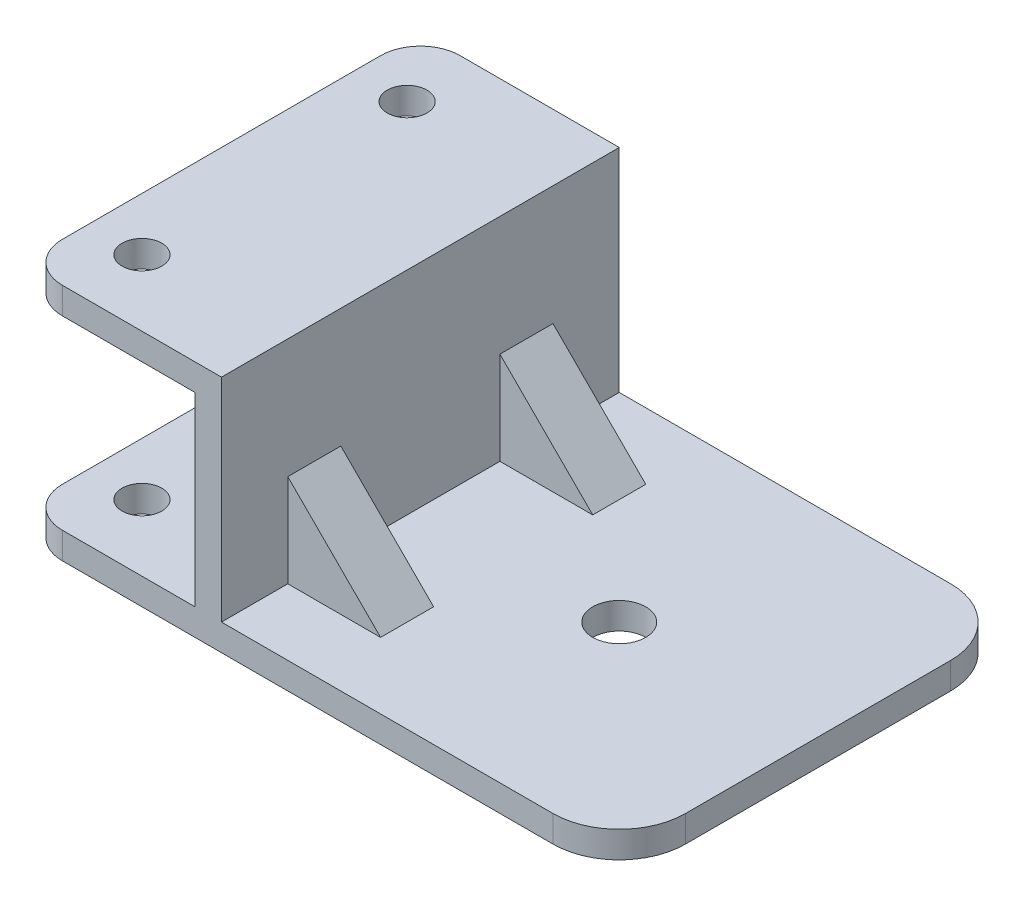
ISO-10303-21;
HEADER;
FILE_DESCRIPTION(('STEP AP214'),'2;1');
FILE_NAME('part.step','',(''),(''),'','','');
FILE_SCHEMA(('AUTOMOTIVE_DESIGN { 1 0 10303 214 1 1 1 1 }'));
ENDSEC;
DATA;
#1=APPLICATION_CONTEXT('core data for automotive mechanical design processes');
#2=APPLICATION_PROTOCOL_DEFINITION('international standard','automotive_design',2000,#1);
#3=PRODUCT_CONTEXT('',#1,'mechanical');
#4=PRODUCT('Part','Part','',(#3));
#5=PRODUCT_RELATED_PRODUCT_CATEGORY('part','',(#4));
#6=PRODUCT_DEFINITION_FORMATION('','',#4);
#7=PRODUCT_DEFINITION_CONTEXT('part definition',#1,'design');
#8=PRODUCT_DEFINITION('design','',#6,#7);
#9=PRODUCT_DEFINITION_SHAPE('','',#8);
#10=(LENGTH_UNIT() NAMED_UNIT(*) SI_UNIT(.MILLI.,.METRE.));
#11=(NAMED_UNIT(*) PLANE_ANGLE_UNIT() SI_UNIT($,.RADIAN.));
#12=(NAMED_UNIT(*) SI_UNIT($,.STERADIAN.) SOLID_ANGLE_UNIT());
#13=UNCERTAINTY_MEASURE_WITH_UNIT(LENGTH_MEASURE(1.E-05),#10,'distance_accuracy_value','');
#14=(GEOMETRIC_REPRESENTATION_CONTEXT(3) GLOBAL_UNCERTAINTY_ASSIGNED_CONTEXT((#13)) GLOBAL_UNIT_ASSIGNED_CONTEXT((#10,
#11,#12)) REPRESENTATION_CONTEXT('',''));
#15=CARTESIAN_POINT('',(0.,0.,0.));
#16=DIRECTION('',(0.,0.,1.));
#17=DIRECTION('',(1.,0.,0.));
#18=AXIS2_PLACEMENT_3D('',#15,#16,#17);
#19=CARTESIAN_POINT('',(15.,9.,10.));
#20=DIRECTION('',(-0.707106781186548,-0.707106781186547,0.));
#21=DIRECTION('',(0.707106781186547,-0.707106781186548,0.));
#22=AXIS2_PLACEMENT_3D('',#19,#20,#21);
#23=PLANE('',#22);
#24=DIRECTION('',(-0.707106781186548,0.707106781186547,0.));
#25=VECTOR('',#24,1.);
#26=CARTESIAN_POINT('',(15.,9.,6.));
#27=LINE('',#26,#25);
#28=CARTESIAN_POINT('',(22.,2.,6.));
#29=VERTEX_POINT('',#28);
#30=CARTESIAN_POINT('',(15.,9.,6.));
#31=VERTEX_POINT('',#30);
#32=EDGE_CURVE('E443',#29,#31,#27,.T.);
#33=ORIENTED_EDGE('',*,*,#32,.T.);
#34=DIRECTION('',(0.,0.,-1.));
#35=VECTOR('',#34,1.);
#36=CARTESIAN_POINT('',(15.,9.,10.));
#37=LINE('',#36,#35);
#38=CARTESIAN_POINT('',(15.,9.,10.));
#39=VERTEX_POINT('',#38);
#40=EDGE_CURVE('E204',#39,#31,#37,.T.);
#41=ORIENTED_EDGE('',*,*,#40,.F.);
#42=DIRECTION('',(-0.707106781186547,0.707106781186548,0.));
#43=VECTOR('',#42,1.);
#44=CARTESIAN_POINT('',(15.,9.,10.));
#45=LINE('',#44,#43);
#46=CARTESIAN_POINT('',(22.,2.,10.));
#47=VERTEX_POINT('',#46);
#48=EDGE_CURVE('E436',#47,#39,#45,.T.);
#49=ORIENTED_EDGE('',*,*,#48,.F.);
#50=DIRECTION('',(0.,0.,-1.));
#51=VECTOR('',#50,1.);
#52=CARTESIAN_POINT('',(22.,2.,10.));
#53=LINE('',#52,#51);
#54=EDGE_CURVE('E203',#47,#29,#53,.T.);
#55=ORIENTED_EDGE('',*,*,#54,.T.);
#56=EDGE_LOOP('',(#33,#41,#49,#55));
#57=FACE_BOUND('',#56,.T.);
#58=ADVANCED_FACE('F33',(#57),#23,.F.);
#59=CARTESIAN_POINT('',(15.,0.,15.));
#60=DIRECTION('',(-1.,0.,0.));
#61=DIRECTION('',(0.,0.,1.));
#62=AXIS2_PLACEMENT_3D('',#59,#60,#61);
#63=PLANE('',#62);
#64=DIRECTION('',(0.,-1.,0.));
#65=VECTOR('',#64,1.);
#66=CARTESIAN_POINT('',(15.,2.,10.));
#67=LINE('',#66,#65);
#68=CARTESIAN_POINT('',(15.,2.,10.));
#69=VERTEX_POINT('',#68);
#70=EDGE_CURVE('E433',#39,#69,#67,.T.);
#71=ORIENTED_EDGE('',*,*,#70,.F.);
#72=ORIENTED_EDGE('',*,*,#40,.T.);
#73=DIRECTION('',(0.,-1.,0.));
#74=VECTOR('',#73,1.);
#75=CARTESIAN_POINT('',(15.,2.,6.));
#76=LINE('',#75,#74);
#77=CARTESIAN_POINT('',(15.,2.,6.));
#78=VERTEX_POINT('',#77);
#79=EDGE_CURVE('E189',#31,#78,#76,.T.);
#80=ORIENTED_EDGE('',*,*,#79,.T.);
#81=DIRECTION('',(0.,0.,1.));
#82=VECTOR('',#81,1.);
#83=CARTESIAN_POINT('',(15.,2.,-6.));
#84=LINE('',#83,#82);
#85=CARTESIAN_POINT('',(15.,2.,-6.));
#86=VERTEX_POINT('',#85);
#87=EDGE_CURVE('E428',#86,#78,#84,.T.);
#88=ORIENTED_EDGE('',*,*,#87,.F.);
#89=DIRECTION('',(0.,-1.,0.));
#90=VECTOR('',#89,1.);
#91=CARTESIAN_POINT('',(15.,2.,-6.));
#92=LINE('',#91,#90);
#93=CARTESIAN_POINT('',(15.,9.,-6.));
#94=VERTEX_POINT('',#93);
#95=EDGE_CURVE('E187',#94,#86,#92,.T.);
#96=ORIENTED_EDGE('',*,*,#95,.F.);
#97=CARTESIAN_POINT('',(15.,9.,-10.));
#98=VERTEX_POINT('',#97);
#99=EDGE_CURVE('E197',#94,#98,#37,.T.);
#100=ORIENTED_EDGE('',*,*,#99,.T.);
#101=DIRECTION('',(0.,-1.,0.));
#102=VECTOR('',#101,1.);
#103=CARTESIAN_POINT('',(15.,2.,-10.));
#104=LINE('',#103,#102);
#105=CARTESIAN_POINT('',(15.,2.,-10.));
#106=VERTEX_POINT('',#105);
#107=EDGE_CURVE('E423',#98,#106,#104,.T.);
#108=ORIENTED_EDGE('',*,*,#107,.T.);
#109=DIRECTION('',(0.,0.,-1.));
#110=VECTOR('',#109,1.);
#111=CARTESIAN_POINT('',(15.,2.,-15.));
#112=LINE('',#111,#110);
#113=CARTESIAN_POINT('',(15.,2.,-15.));
#114=VERTEX_POINT('',#113);
#115=EDGE_CURVE('E216',#106,#114,#112,.T.);
#116=ORIENTED_EDGE('',*,*,#115,.T.);
#117=DIRECTION('',(0.,1.,0.));
#118=VECTOR('',#117,1.);
#119=CARTESIAN_POINT('',(15.,0.,-15.));
#120=LINE('',#119,#118);
#121=CARTESIAN_POINT('',(15.,18.,-15.));
#122=VERTEX_POINT('',#121);
#123=EDGE_CURVE('E264',#114,#122,#120,.T.);
#124=ORIENTED_EDGE('',*,*,#123,.T.);
#125=DIRECTION('',(0.,0.,-1.));
#126=VECTOR('',#125,1.);
#127=CARTESIAN_POINT('',(15.,18.,15.));
#128=LINE('',#127,#126);
#129=CARTESIAN_POINT('',(15.,18.,15.));
#130=VERTEX_POINT('',#129);
#131=EDGE_CURVE('E289',#130,#122,#128,.T.);
#132=ORIENTED_EDGE('',*,*,#131,.F.);
#133=DIRECTION('',(0.,1.,0.));
#134=VECTOR('',#133,1.);
#135=CARTESIAN_POINT('',(15.,0.,15.));
#136=LINE('',#135,#134);
#137=CARTESIAN_POINT('',(15.,2.,15.));
#138=VERTEX_POINT('',#137);
#139=EDGE_CURVE('E248',#138,#130,#136,.T.);
#140=ORIENTED_EDGE('',*,*,#139,.F.);
#141=EDGE_CURVE('E212',#138,#69,#112,.T.);
#142=ORIENTED_EDGE('',*,*,#141,.T.);
#143=EDGE_LOOP('',(#71,#72,#80,#88,#96,#100,#108,#116,#124,#132,#140,#142));
#144=FACE_BOUND('',#143,.T.);
#145=ADVANCED_FACE('F420',(#144),#63,.F.);
#146=CARTESIAN_POINT('',(0.,2.,0.));
#147=DIRECTION('',(0.,1.,0.));
#148=DIRECTION('',(0.,0.,1.));
#149=AXIS2_PLACEMENT_3D('',#146,#147,#148);
#150=PLANE('',#149);
#151=CARTESIAN_POINT('',(30.,2.,0.));
#152=DIRECTION('',(0.,1.,0.));
#153=DIRECTION('',(0.,0.,1.));
#154=AXIS2_PLACEMENT_3D('',#151,#152,#153);
#155=CIRCLE('',#154,2.);
#156=CARTESIAN_POINT('',(30.,2.,2.));
#157=VERTEX_POINT('',#156);
#158=EDGE_CURVE('E340',#157,#157,#155,.T.);
#159=ORIENTED_EDGE('',*,*,#158,.F.);
#160=EDGE_LOOP('',(#159));
#161=FACE_BOUND('',#160,.T.);
#162=DIRECTION('',(0.,0.,1.));
#163=VECTOR('',#162,1.);
#164=CARTESIAN_POINT('',(45.,2.,-15.));
#165=LINE('',#164,#163);
#166=CARTESIAN_POINT('',(45.,2.,-10.));
#167=VERTEX_POINT('',#166);
#168=CARTESIAN_POINT('',(45.,2.,10.));
#169=VERTEX_POINT('',#168);
#170=EDGE_CURVE('E219',#167,#169,#165,.T.);
#171=ORIENTED_EDGE('',*,*,#170,.F.);
#172=CARTESIAN_POINT('',(40.,2.,-10.));
#173=DIRECTION('',(0.,1.,0.));
#174=DIRECTION('',(0.,0.,1.));
#175=AXIS2_PLACEMENT_3D('',#172,#173,#174);
#176=CIRCLE('',#175,5.);
#177=CARTESIAN_POINT('',(40.,2.,-15.));
#178=VERTEX_POINT('',#177);
#179=EDGE_CURVE('E41',#167,#178,#176,.T.);
#180=ORIENTED_EDGE('',*,*,#179,.T.);
#181=DIRECTION('',(1.,0.,0.));
#182=VECTOR('',#181,1.);
#183=CARTESIAN_POINT('',(15.,2.,-15.));
#184=LINE('',#183,#182);
#185=EDGE_CURVE('E215',#114,#178,#184,.T.);
#186=ORIENTED_EDGE('',*,*,#185,.F.);
#187=ORIENTED_EDGE('',*,*,#115,.F.);
#188=DIRECTION('',(1.,0.,0.));
#189=VECTOR('',#188,1.);
#190=CARTESIAN_POINT('',(22.,2.,-10.));
#191=LINE('',#190,#189);
#192=CARTESIAN_POINT('',(22.,2.,-10.));
#193=VERTEX_POINT('',#192);
#194=EDGE_CURVE('E201',#106,#193,#191,.T.);
#195=ORIENTED_EDGE('',*,*,#194,.T.);
#196=CARTESIAN_POINT('',(22.,2.,-6.));
#197=VERTEX_POINT('',#196);
#198=EDGE_CURVE('E195',#197,#193,#53,.T.);
#199=ORIENTED_EDGE('',*,*,#198,.F.);
#200=DIRECTION('',(1.,0.,0.));
#201=VECTOR('',#200,1.);
#202=CARTESIAN_POINT('',(22.,2.,-6.));
#203=LINE('',#202,#201);
#204=EDGE_CURVE('E182',#86,#197,#203,.T.);
#205=ORIENTED_EDGE('',*,*,#204,.F.);
#206=ORIENTED_EDGE('',*,*,#87,.T.);
#207=DIRECTION('',(1.,0.,0.));
#208=VECTOR('',#207,1.);
#209=CARTESIAN_POINT('',(22.,2.,6.));
#210=LINE('',#209,#208);
#211=EDGE_CURVE('E339',#78,#29,#210,.T.);
#212=ORIENTED_EDGE('',*,*,#211,.T.);
#213=ORIENTED_EDGE('',*,*,#54,.F.);
#214=DIRECTION('',(1.,0.,0.));
#215=VECTOR('',#214,1.);
#216=CARTESIAN_POINT('',(22.,2.,10.));
#217=LINE('',#216,#215);
#218=EDGE_CURVE('E425',#69,#47,#217,.T.);
#219=ORIENTED_EDGE('',*,*,#218,.F.);
#220=ORIENTED_EDGE('',*,*,#141,.F.);
#221=DIRECTION('',(-1.,0.,0.));
#222=VECTOR('',#221,1.);
#223=CARTESIAN_POINT('',(15.,2.,15.));
#224=LINE('',#223,#222);
#225=CARTESIAN_POINT('',(40.,2.,15.));
#226=VERTEX_POINT('',#225);
#227=EDGE_CURVE('E221',#226,#138,#224,.T.);
#228=ORIENTED_EDGE('',*,*,#227,.F.);
#229=CARTESIAN_POINT('',(40.,2.,10.));
#230=DIRECTION('',(0.,1.,0.));
#231=DIRECTION('',(0.,0.,1.));
#232=AXIS2_PLACEMENT_3D('',#229,#230,#231);
#233=CIRCLE('',#232,5.);
#234=EDGE_CURVE('E53',#226,#169,#233,.T.);
#235=ORIENTED_EDGE('',*,*,#234,.T.);
#236=EDGE_LOOP('',(#171,#180,#186,#187,#195,#199,#205,#206,#212,#213,#219,#220,#228,#235));
#237=FACE_BOUND('',#236,.T.);
#238=ADVANCED_FACE('F199',(#161,#237),#150,.T.);
#239=CARTESIAN_POINT('',(0.,2.,15.));
#240=DIRECTION('',(1.,0.,0.));
#241=DIRECTION('',(0.,1.,0.));
#242=AXIS2_PLACEMENT_3D('',#239,#240,#241);
#243=PLANE('',#242);
#244=DIRECTION('',(0.,0.,-1.));
#245=VECTOR('',#244,1.);
#246=CARTESIAN_POINT('',(0.,0.,15.));
#247=LINE('',#246,#245);
#248=CARTESIAN_POINT('',(0.,0.,12.));
#249=VERTEX_POINT('',#248);
#250=CARTESIAN_POINT('',(0.,0.,-12.));
#251=VERTEX_POINT('',#250);
#252=EDGE_CURVE('E292',#249,#251,#247,.T.);
#253=ORIENTED_EDGE('',*,*,#252,.F.);
#254=DIRECTION('',(0.,-1.,0.));
#255=VECTOR('',#254,1.);
#256=CARTESIAN_POINT('',(0.,2.,12.));
#257=LINE('',#256,#255);
#258=CARTESIAN_POINT('',(0.,2.,12.));
#259=VERTEX_POINT('',#258);
#260=EDGE_CURVE('E312',#249,#259,#257,.F.);
#261=ORIENTED_EDGE('',*,*,#260,.T.);
#262=DIRECTION('',(0.,0.,-1.));
#263=VECTOR('',#262,1.);
#264=CARTESIAN_POINT('',(0.,2.,15.));
#265=LINE('',#264,#263);
#266=CARTESIAN_POINT('',(0.,2.,-12.));
#267=VERTEX_POINT('',#266);
#268=EDGE_CURVE('E261',#259,#267,#265,.T.);
#269=ORIENTED_EDGE('',*,*,#268,.T.);
#270=DIRECTION('',(0.,-1.,0.));
#271=VECTOR('',#270,1.);
#272=CARTESIAN_POINT('',(0.,2.,-12.));
#273=LINE('',#272,#271);
#274=EDGE_CURVE('E309',#267,#251,#273,.T.);
#275=ORIENTED_EDGE('',*,*,#274,.T.);
#276=EDGE_LOOP('',(#253,#261,#269,#275));
#277=FACE_BOUND('',#276,.T.);
#278=ADVANCED_FACE('F380',(#277),#243,.F.);
#279=CARTESIAN_POINT('',(0.,0.,15.));
#280=DIRECTION('',(0.,1.,0.));
#281=DIRECTION('',(0.,0.,1.));
#282=AXIS2_PLACEMENT_3D('',#279,#280,#281);
#283=PLANE('',#282);
#284=CARTESIAN_POINT('',(30.,0.,0.));
#285=DIRECTION('',(0.,1.,0.));
#286=DIRECTION('',(0.,0.,1.));
#287=AXIS2_PLACEMENT_3D('',#284,#285,#286);
#288=CIRCLE('',#287,2.);
#289=CARTESIAN_POINT('',(30.,0.,2.));
#290=VERTEX_POINT('',#289);
#291=EDGE_CURVE('E336',#290,#290,#288,.T.);
#292=ORIENTED_EDGE('',*,*,#291,.T.);
#293=EDGE_LOOP('',(#292));
#294=FACE_BOUND('',#293,.T.);
#295=CARTESIAN_POINT('',(4.,0.,-10.));
#296=DIRECTION('',(0.,1.,0.));
#297=DIRECTION('',(0.,0.,1.));
#298=AXIS2_PLACEMENT_3D('',#295,#296,#297);
#299=CIRCLE('',#298,1.5);
#300=CARTESIAN_POINT('',(4.,0.,-8.5));
#301=VERTEX_POINT('',#300);
#302=EDGE_CURVE('E226',#301,#301,#299,.T.);
#303=ORIENTED_EDGE('',*,*,#302,.T.);
#304=EDGE_LOOP('',(#303));
#305=FACE_BOUND('',#304,.T.);
#306=CARTESIAN_POINT('',(4.,0.,10.));
#307=DIRECTION('',(0.,1.,0.));
#308=DIRECTION('',(0.,0.,1.));
#309=AXIS2_PLACEMENT_3D('',#306,#307,#308);
#310=CIRCLE('',#309,1.5);
#311=CARTESIAN_POINT('',(4.,0.,11.5));
#312=VERTEX_POINT('',#311);
#313=EDGE_CURVE('E236',#312,#312,#310,.T.);
#314=ORIENTED_EDGE('',*,*,#313,.T.);
#315=EDGE_LOOP('',(#314));
#316=FACE_BOUND('',#315,.T.);
#317=DIRECTION('',(1.,0.,0.));
#318=VECTOR('',#317,1.);
#319=CARTESIAN_POINT('',(0.,0.,-15.));
#320=LINE('',#319,#318);
#321=CARTESIAN_POINT('',(3.,0.,-15.));
#322=VERTEX_POINT('',#321);
#323=CARTESIAN_POINT('',(40.,0.,-15.));
#324=VERTEX_POINT('',#323);
#325=EDGE_CURVE('E245',#322,#324,#320,.T.);
#326=ORIENTED_EDGE('',*,*,#325,.T.);
#327=CARTESIAN_POINT('',(40.,0.,-10.));
#328=DIRECTION('',(0.,1.,0.));
#329=DIRECTION('',(0.,0.,1.));
#330=AXIS2_PLACEMENT_3D('',#327,#328,#329);
#331=CIRCLE('',#330,5.);
#332=CARTESIAN_POINT('',(45.,0.,-10.));
#333=VERTEX_POINT('',#332);
#334=EDGE_CURVE('E345',#324,#333,#331,.F.);
#335=ORIENTED_EDGE('',*,*,#334,.T.);
#336=DIRECTION('',(0.,0.,1.));
#337=VECTOR('',#336,1.);
#338=CARTESIAN_POINT('',(45.,0.,-15.));
#339=LINE('',#338,#337);
#340=CARTESIAN_POINT('',(45.,0.,10.));
#341=VERTEX_POINT('',#340);
#342=EDGE_CURVE('E207',#333,#341,#339,.T.);
#343=ORIENTED_EDGE('',*,*,#342,.T.);
#344=CARTESIAN_POINT('',(40.,0.,10.));
#345=DIRECTION('',(0.,1.,0.));
#346=DIRECTION('',(0.,0.,1.));
#347=AXIS2_PLACEMENT_3D('',#344,#345,#346);
#348=CIRCLE('',#347,5.);
#349=CARTESIAN_POINT('',(40.,0.,15.));
#350=VERTEX_POINT('',#349);
#351=EDGE_CURVE('E343',#341,#350,#348,.F.);
#352=ORIENTED_EDGE('',*,*,#351,.T.);
#353=DIRECTION('',(1.,0.,0.));
#354=VECTOR('',#353,1.);
#355=CARTESIAN_POINT('',(0.,0.,15.));
#356=LINE('',#355,#354);
#357=CARTESIAN_POINT('',(3.,0.,15.));
#358=VERTEX_POINT('',#357);
#359=EDGE_CURVE('E246',#358,#350,#356,.T.);
#360=ORIENTED_EDGE('',*,*,#359,.F.);
#361=CARTESIAN_POINT('',(3.,0.,12.));
#362=DIRECTION('',(0.,1.,0.));
#363=DIRECTION('',(0.,0.,1.));
#364=AXIS2_PLACEMENT_3D('',#361,#362,#363);
#365=CIRCLE('',#364,3.);
#366=EDGE_CURVE('E307',#358,#249,#365,.F.);
#367=ORIENTED_EDGE('',*,*,#366,.T.);
#368=ORIENTED_EDGE('',*,*,#252,.T.);
#369=CARTESIAN_POINT('',(3.,0.,-12.));
#370=DIRECTION('',(0.,1.,0.));
#371=DIRECTION('',(0.,0.,1.));
#372=AXIS2_PLACEMENT_3D('',#369,#370,#371);
#373=CIRCLE('',#372,3.);
#374=EDGE_CURVE('E305',#251,#322,#373,.F.);
#375=ORIENTED_EDGE('',*,*,#374,.T.);
#376=EDGE_LOOP('',(#326,#335,#343,#352,#360,#367,#368,#375));
#377=FACE_BOUND('',#376,.T.);
#378=ADVANCED_FACE('F365',(#294,#305,#316,#377),#283,.F.);
#379=CARTESIAN_POINT('',(15.,18.,15.));
#380=DIRECTION('',(0.,-1.,0.));
#381=DIRECTION('',(0.,0.,-1.));
#382=AXIS2_PLACEMENT_3D('',#379,#380,#381);
#383=PLANE('',#382);
#384=CARTESIAN_POINT('',(4.,18.,-10.));
#385=DIRECTION('',(0.,1.,0.));
#386=DIRECTION('',(0.,0.,1.));
#387=AXIS2_PLACEMENT_3D('',#384,#385,#386);
#388=CIRCLE('',#387,1.5);
#389=CARTESIAN_POINT('',(4.,18.,-8.5));
#390=VERTEX_POINT('',#389);
#391=EDGE_CURVE('E223',#390,#390,#388,.T.);
#392=ORIENTED_EDGE('',*,*,#391,.F.);
#393=EDGE_LOOP('',(#392));
#394=FACE_BOUND('',#393,.T.);
#395=CARTESIAN_POINT('',(4.,18.,10.));
#396=DIRECTION('',(0.,1.,0.));
#397=DIRECTION('',(0.,0.,1.));
#398=AXIS2_PLACEMENT_3D('',#395,#396,#397);
#399=CIRCLE('',#398,1.5);
#400=CARTESIAN_POINT('',(4.,18.,11.5));
#401=VERTEX_POINT('',#400);
#402=EDGE_CURVE('E235',#401,#401,#399,.T.);
#403=ORIENTED_EDGE('',*,*,#402,.F.);
#404=EDGE_LOOP('',(#403));
#405=FACE_BOUND('',#404,.T.);
#406=DIRECTION('',(-1.,0.,0.));
#407=VECTOR('',#406,1.);
#408=CARTESIAN_POINT('',(15.,18.,-15.));
#409=LINE('',#408,#407);
#410=CARTESIAN_POINT('',(3.,18.,-15.));
#411=VERTEX_POINT('',#410);
#412=EDGE_CURVE('E266',#122,#411,#409,.T.);
#413=ORIENTED_EDGE('',*,*,#412,.T.);
#414=CARTESIAN_POINT('',(3.,18.,-12.));
#415=DIRECTION('',(0.,-1.,0.));
#416=DIRECTION('',(0.,0.,-1.));
#417=AXIS2_PLACEMENT_3D('',#414,#415,#416);
#418=CIRCLE('',#417,3.);
#419=CARTESIAN_POINT('',(0.,18.,-12.));
#420=VERTEX_POINT('',#419);
#421=EDGE_CURVE('E333',#411,#420,#418,.F.);
#422=ORIENTED_EDGE('',*,*,#421,.T.);
#423=DIRECTION('',(0.,0.,-1.));
#424=VECTOR('',#423,1.);
#425=CARTESIAN_POINT('',(0.,18.,15.));
#426=LINE('',#425,#424);
#427=CARTESIAN_POINT('',(0.,18.,12.));
#428=VERTEX_POINT('',#427);
#429=EDGE_CURVE('E286',#428,#420,#426,.T.);
#430=ORIENTED_EDGE('',*,*,#429,.F.);
#431=CARTESIAN_POINT('',(3.,18.,12.));
#432=DIRECTION('',(0.,-1.,0.));
#433=DIRECTION('',(0.,0.,-1.));
#434=AXIS2_PLACEMENT_3D('',#431,#432,#433);
#435=CIRCLE('',#434,3.);
#436=CARTESIAN_POINT('',(3.,18.,15.));
#437=VERTEX_POINT('',#436);
#438=EDGE_CURVE('E331',#428,#437,#435,.F.);
#439=ORIENTED_EDGE('',*,*,#438,.T.);
#440=DIRECTION('',(-1.,0.,0.));
#441=VECTOR('',#440,1.);
#442=CARTESIAN_POINT('',(15.,18.,15.));
#443=LINE('',#442,#441);
#444=EDGE_CURVE('E251',#130,#437,#443,.T.);
#445=ORIENTED_EDGE('',*,*,#444,.F.);
#446=ORIENTED_EDGE('',*,*,#131,.T.);
#447=EDGE_LOOP('',(#413,#422,#430,#439,#445,#446));
#448=FACE_BOUND('',#447,.T.);
#449=ADVANCED_FACE('F405',(#394,#405,#448),#383,.F.);
#450=CARTESIAN_POINT('',(0.,18.,15.));
#451=DIRECTION('',(1.,0.,0.));
#452=DIRECTION('',(0.,1.,0.));
#453=AXIS2_PLACEMENT_3D('',#450,#451,#452);
#454=PLANE('',#453);
#455=ORIENTED_EDGE('',*,*,#429,.T.);
#456=DIRECTION('',(0.,-1.,0.));
#457=VECTOR('',#456,1.);
#458=CARTESIAN_POINT('',(0.,18.,-12.));
#459=LINE('',#458,#457);
#460=CARTESIAN_POINT('',(0.,16.,-12.));
#461=VERTEX_POINT('',#460);
#462=EDGE_CURVE('E324',#420,#461,#459,.T.);
#463=ORIENTED_EDGE('',*,*,#462,.T.);
#464=DIRECTION('',(0.,0.,-1.));
#465=VECTOR('',#464,1.);
#466=CARTESIAN_POINT('',(0.,16.,15.));
#467=LINE('',#466,#465);
#468=CARTESIAN_POINT('',(0.,16.,12.));
#469=VERTEX_POINT('',#468);
#470=EDGE_CURVE('E283',#469,#461,#467,.T.);
#471=ORIENTED_EDGE('',*,*,#470,.F.);
#472=DIRECTION('',(0.,-1.,0.));
#473=VECTOR('',#472,1.);
#474=CARTESIAN_POINT('',(0.,18.,12.));
#475=LINE('',#474,#473);
#476=EDGE_CURVE('E322',#469,#428,#475,.F.);
#477=ORIENTED_EDGE('',*,*,#476,.T.);
#478=EDGE_LOOP('',(#455,#463,#471,#477));
#479=FACE_BOUND('',#478,.T.);
#480=ADVANCED_FACE('F408',(#479),#454,.F.);
#481=CARTESIAN_POINT('',(0.,16.,15.));
#482=DIRECTION('',(0.,1.,0.));
#483=DIRECTION('',(-1.,0.,0.));
#484=AXIS2_PLACEMENT_3D('',#481,#482,#483);
#485=PLANE('',#484);
#486=CARTESIAN_POINT('',(4.,16.,-10.));
#487=DIRECTION('',(0.,1.,0.));
#488=DIRECTION('',(-1.,0.,0.));
#489=AXIS2_PLACEMENT_3D('',#486,#487,#488);
#490=CIRCLE('',#489,1.5);
#491=CARTESIAN_POINT('',(2.5,16.,-10.));
#492=VERTEX_POINT('',#491);
#493=EDGE_CURVE('E232',#492,#492,#490,.T.);
#494=ORIENTED_EDGE('',*,*,#493,.T.);
#495=EDGE_LOOP('',(#494));
#496=FACE_BOUND('',#495,.T.);
#497=CARTESIAN_POINT('',(4.,16.,10.));
#498=DIRECTION('',(0.,1.,0.));
#499=DIRECTION('',(-1.,0.,0.));
#500=AXIS2_PLACEMENT_3D('',#497,#498,#499);
#501=CIRCLE('',#500,1.5);
#502=CARTESIAN_POINT('',(2.5,16.,10.));
#503=VERTEX_POINT('',#502);
#504=EDGE_CURVE('E242',#503,#503,#501,.T.);
#505=ORIENTED_EDGE('',*,*,#504,.T.);
#506=EDGE_LOOP('',(#505));
#507=FACE_BOUND('',#506,.T.);
#508=ORIENTED_EDGE('',*,*,#470,.T.);
#509=CARTESIAN_POINT('',(3.,16.,-12.));
#510=DIRECTION('',(0.,1.,0.));
#511=DIRECTION('',(-1.,0.,0.));
#512=AXIS2_PLACEMENT_3D('',#509,#510,#511);
#513=CIRCLE('',#512,3.);
#514=CARTESIAN_POINT('',(3.,16.,-15.));
#515=VERTEX_POINT('',#514);
#516=EDGE_CURVE('E329',#461,#515,#513,.F.);
#517=ORIENTED_EDGE('',*,*,#516,.T.);
#518=DIRECTION('',(1.,0.,0.));
#519=VECTOR('',#518,1.);
#520=CARTESIAN_POINT('',(0.,16.,-15.));
#521=LINE('',#520,#519);
#522=CARTESIAN_POINT('',(13.,16.,-15.));
#523=VERTEX_POINT('',#522);
#524=EDGE_CURVE('E269',#515,#523,#521,.T.);
#525=ORIENTED_EDGE('',*,*,#524,.T.);
#526=DIRECTION('',(0.,0.,-1.));
#527=VECTOR('',#526,1.);
#528=CARTESIAN_POINT('',(13.,16.,15.));
#529=LINE('',#528,#527);
#530=CARTESIAN_POINT('',(13.,16.,15.));
#531=VERTEX_POINT('',#530);
#532=EDGE_CURVE('E280',#531,#523,#529,.T.);
#533=ORIENTED_EDGE('',*,*,#532,.F.);
#534=DIRECTION('',(1.,0.,0.));
#535=VECTOR('',#534,1.);
#536=CARTESIAN_POINT('',(0.,16.,15.));
#537=LINE('',#536,#535);
#538=CARTESIAN_POINT('',(3.,16.,15.));
#539=VERTEX_POINT('',#538);
#540=EDGE_CURVE('E254',#539,#531,#537,.T.);
#541=ORIENTED_EDGE('',*,*,#540,.F.);
#542=CARTESIAN_POINT('',(3.,16.,12.));
#543=DIRECTION('',(0.,1.,0.));
#544=DIRECTION('',(-1.,0.,0.));
#545=AXIS2_PLACEMENT_3D('',#542,#543,#544);
#546=CIRCLE('',#545,3.);
#547=EDGE_CURVE('E327',#539,#469,#546,.F.);
#548=ORIENTED_EDGE('',*,*,#547,.T.);
#549=EDGE_LOOP('',(#508,#517,#525,#533,#541,#548));
#550=FACE_BOUND('',#549,.T.);
#551=ADVANCED_FACE('F502',(#496,#507,#550),#485,.F.);
#552=CARTESIAN_POINT('',(13.,16.,15.));
#553=DIRECTION('',(1.,0.,0.));
#554=DIRECTION('',(0.,1.,0.));
#555=AXIS2_PLACEMENT_3D('',#552,#553,#554);
#556=PLANE('',#555);
#557=DIRECTION('',(0.,-1.,0.));
#558=VECTOR('',#557,1.);
#559=CARTESIAN_POINT('',(13.,16.,-15.));
#560=LINE('',#559,#558);
#561=CARTESIAN_POINT('',(13.,2.,-15.));
#562=VERTEX_POINT('',#561);
#563=EDGE_CURVE('E271',#523,#562,#560,.T.);
#564=ORIENTED_EDGE('',*,*,#563,.T.);
#565=DIRECTION('',(0.,0.,-1.));
#566=VECTOR('',#565,1.);
#567=CARTESIAN_POINT('',(13.,2.,15.));
#568=LINE('',#567,#566);
#569=CARTESIAN_POINT('',(13.,2.,15.));
#570=VERTEX_POINT('',#569);
#571=EDGE_CURVE('E277',#570,#562,#568,.T.);
#572=ORIENTED_EDGE('',*,*,#571,.F.);
#573=DIRECTION('',(0.,-1.,0.));
#574=VECTOR('',#573,1.);
#575=CARTESIAN_POINT('',(13.,16.,15.));
#576=LINE('',#575,#574);
#577=EDGE_CURVE('E256',#531,#570,#576,.T.);
#578=ORIENTED_EDGE('',*,*,#577,.F.);
#579=ORIENTED_EDGE('',*,*,#532,.T.);
#580=EDGE_LOOP('',(#564,#572,#578,#579));
#581=FACE_BOUND('',#580,.T.);
#582=ADVANCED_FACE('F394',(#581),#556,.F.);
#583=CARTESIAN_POINT('',(13.,2.,15.));
#584=DIRECTION('',(0.,-1.,0.));
#585=DIRECTION('',(1.,0.,0.));
#586=AXIS2_PLACEMENT_3D('',#583,#584,#585);
#587=PLANE('',#586);
#588=CARTESIAN_POINT('',(4.,2.,-10.));
#589=DIRECTION('',(0.,-1.,0.));
#590=DIRECTION('',(1.,0.,0.));
#591=AXIS2_PLACEMENT_3D('',#588,#589,#590);
#592=CIRCLE('',#591,1.5);
#593=CARTESIAN_POINT('',(5.5,2.,-10.));
#594=VERTEX_POINT('',#593);
#595=EDGE_CURVE('E229',#594,#594,#592,.T.);
#596=ORIENTED_EDGE('',*,*,#595,.T.);
#597=EDGE_LOOP('',(#596));
#598=FACE_BOUND('',#597,.T.);
#599=CARTESIAN_POINT('',(4.,2.,10.));
#600=DIRECTION('',(0.,-1.,0.));
#601=DIRECTION('',(1.,0.,0.));
#602=AXIS2_PLACEMENT_3D('',#599,#600,#601);
#603=CIRCLE('',#602,1.5);
#604=CARTESIAN_POINT('',(5.5,2.,10.));
#605=VERTEX_POINT('',#604);
#606=EDGE_CURVE('E239',#605,#605,#603,.T.);
#607=ORIENTED_EDGE('',*,*,#606,.T.);
#608=EDGE_LOOP('',(#607));
#609=FACE_BOUND('',#608,.T.);
#610=ORIENTED_EDGE('',*,*,#268,.F.);
#611=CARTESIAN_POINT('',(3.,2.,12.));
#612=DIRECTION('',(0.,-1.,0.));
#613=DIRECTION('',(1.,0.,0.));
#614=AXIS2_PLACEMENT_3D('',#611,#612,#613);
#615=CIRCLE('',#614,3.);
#616=CARTESIAN_POINT('',(3.,2.,15.));
#617=VERTEX_POINT('',#616);
#618=EDGE_CURVE('E316',#259,#617,#615,.F.);
#619=ORIENTED_EDGE('',*,*,#618,.T.);
#620=DIRECTION('',(-1.,0.,0.));
#621=VECTOR('',#620,1.);
#622=CARTESIAN_POINT('',(13.,2.,15.));
#623=LINE('',#622,#621);
#624=EDGE_CURVE('E258',#570,#617,#623,.T.);
#625=ORIENTED_EDGE('',*,*,#624,.F.);
#626=ORIENTED_EDGE('',*,*,#571,.T.);
#627=DIRECTION('',(-1.,0.,0.));
#628=VECTOR('',#627,1.);
#629=CARTESIAN_POINT('',(13.,2.,-15.));
#630=LINE('',#629,#628);
#631=CARTESIAN_POINT('',(3.,2.,-15.));
#632=VERTEX_POINT('',#631);
#633=EDGE_CURVE('E249',#562,#632,#630,.T.);
#634=ORIENTED_EDGE('',*,*,#633,.T.);
#635=CARTESIAN_POINT('',(3.,2.,-12.));
#636=DIRECTION('',(0.,-1.,0.));
#637=DIRECTION('',(1.,0.,0.));
#638=AXIS2_PLACEMENT_3D('',#635,#636,#637);
#639=CIRCLE('',#638,3.);
#640=EDGE_CURVE('E314',#632,#267,#639,.F.);
#641=ORIENTED_EDGE('',*,*,#640,.T.);
#642=EDGE_LOOP('',(#610,#619,#625,#626,#634,#641));
#643=FACE_BOUND('',#642,.T.);
#644=ADVANCED_FACE('F390',(#598,#609,#643),#587,.F.);
#645=CARTESIAN_POINT('',(0.,0.,15.));
#646=DIRECTION('',(0.,0.,1.));
#647=DIRECTION('',(1.,0.,0.));
#648=AXIS2_PLACEMENT_3D('',#645,#646,#647);
#649=PLANE('',#648);
#650=ORIENTED_EDGE('',*,*,#359,.T.);
#651=DIRECTION('',(0.,-1.,0.));
#652=VECTOR('',#651,1.);
#653=CARTESIAN_POINT('',(40.,0.,15.));
#654=LINE('',#653,#652);
#655=EDGE_CURVE('E11',#350,#226,#654,.F.);
#656=ORIENTED_EDGE('',*,*,#655,.T.);
#657=ORIENTED_EDGE('',*,*,#227,.T.);
#658=ORIENTED_EDGE('',*,*,#139,.T.);
#659=ORIENTED_EDGE('',*,*,#444,.T.);
#660=DIRECTION('',(0.,-1.,0.));
#661=VECTOR('',#660,1.);
#662=CARTESIAN_POINT('',(3.,16.,15.));
#663=LINE('',#662,#661);
#664=EDGE_CURVE('E295',#437,#539,#663,.T.);
#665=ORIENTED_EDGE('',*,*,#664,.T.);
#666=ORIENTED_EDGE('',*,*,#540,.T.);
#667=ORIENTED_EDGE('',*,*,#577,.T.);
#668=ORIENTED_EDGE('',*,*,#624,.T.);
#669=DIRECTION('',(0.,-1.,0.));
#670=VECTOR('',#669,1.);
#671=CARTESIAN_POINT('',(3.,0.,15.));
#672=LINE('',#671,#670);
#673=EDGE_CURVE('E302',#617,#358,#672,.T.);
#674=ORIENTED_EDGE('',*,*,#673,.T.);
#675=EDGE_LOOP('',(#650,#656,#657,#658,#659,#665,#666,#667,#668,#674));
#676=FACE_BOUND('',#675,.T.);
#677=ADVANCED_FACE('F371',(#676),#649,.T.);
#678=CARTESIAN_POINT('',(0.,0.,-15.));
#679=DIRECTION('',(0.,0.,1.));
#680=DIRECTION('',(1.,0.,0.));
#681=AXIS2_PLACEMENT_3D('',#678,#679,#680);
#682=PLANE('',#681);
#683=ORIENTED_EDGE('',*,*,#185,.T.);
#684=DIRECTION('',(0.,-1.,0.));
#685=VECTOR('',#684,1.);
#686=CARTESIAN_POINT('',(40.,0.,-15.));
#687=LINE('',#686,#685);
#688=EDGE_CURVE('E335',#178,#324,#687,.T.);
#689=ORIENTED_EDGE('',*,*,#688,.T.);
#690=ORIENTED_EDGE('',*,*,#325,.F.);
#691=DIRECTION('',(0.,-1.,0.));
#692=VECTOR('',#691,1.);
#693=CARTESIAN_POINT('',(3.,0.,-15.));
#694=LINE('',#693,#692);
#695=EDGE_CURVE('E320',#322,#632,#694,.F.);
#696=ORIENTED_EDGE('',*,*,#695,.T.);
#697=ORIENTED_EDGE('',*,*,#633,.F.);
#698=ORIENTED_EDGE('',*,*,#563,.F.);
#699=ORIENTED_EDGE('',*,*,#524,.F.);
#700=DIRECTION('',(0.,-1.,0.));
#701=VECTOR('',#700,1.);
#702=CARTESIAN_POINT('',(3.,0.,-15.));
#703=LINE('',#702,#701);
#704=EDGE_CURVE('E318',#515,#411,#703,.F.);
#705=ORIENTED_EDGE('',*,*,#704,.T.);
#706=ORIENTED_EDGE('',*,*,#412,.F.);
#707=ORIENTED_EDGE('',*,*,#123,.F.);
#708=EDGE_LOOP('',(#683,#689,#690,#696,#697,#698,#699,#705,#706,#707));
#709=FACE_BOUND('',#708,.T.);
#710=ADVANCED_FACE('F359',(#709),#682,.F.);
#711=CARTESIAN_POINT('',(4.,0.,10.));
#712=DIRECTION('',(0.,1.,0.));
#713=DIRECTION('',(0.,0.,1.));
#714=AXIS2_PLACEMENT_3D('',#711,#712,#713);
#715=CYLINDRICAL_SURFACE('',#714,1.5);
#716=ORIENTED_EDGE('',*,*,#313,.F.);
#717=EDGE_LOOP('',(#716));
#718=FACE_BOUND('',#717,.T.);
#719=ORIENTED_EDGE('',*,*,#606,.F.);
#720=EDGE_LOOP('',(#719));
#721=FACE_BOUND('',#720,.T.);
#722=ADVANCED_FACE('F491',(#718,#721),#715,.F.);
#723=ORIENTED_EDGE('',*,*,#402,.T.);
#724=EDGE_LOOP('',(#723));
#725=FACE_BOUND('',#724,.T.);
#726=ORIENTED_EDGE('',*,*,#504,.F.);
#727=EDGE_LOOP('',(#726));
#728=FACE_BOUND('',#727,.T.);
#729=ADVANCED_FACE('F488',(#725,#728),#715,.F.);
#730=CARTESIAN_POINT('',(4.,0.,-10.));
#731=DIRECTION('',(0.,1.,0.));
#732=DIRECTION('',(0.,0.,1.));
#733=AXIS2_PLACEMENT_3D('',#730,#731,#732);
#734=CYLINDRICAL_SURFACE('',#733,1.5);
#735=ORIENTED_EDGE('',*,*,#302,.F.);
#736=EDGE_LOOP('',(#735));
#737=FACE_BOUND('',#736,.T.);
#738=ORIENTED_EDGE('',*,*,#595,.F.);
#739=EDGE_LOOP('',(#738));
#740=FACE_BOUND('',#739,.T.);
#741=ADVANCED_FACE('F486',(#737,#740),#734,.F.);
#742=ORIENTED_EDGE('',*,*,#391,.T.);
#743=EDGE_LOOP('',(#742));
#744=FACE_BOUND('',#743,.T.);
#745=ORIENTED_EDGE('',*,*,#493,.F.);
#746=EDGE_LOOP('',(#745));
#747=FACE_BOUND('',#746,.T.);
#748=ADVANCED_FACE('F483',(#744,#747),#734,.F.);
#749=CARTESIAN_POINT('',(3.,0.,12.));
#750=DIRECTION('',(0.,1.,0.));
#751=DIRECTION('',(-1.,0.,0.));
#752=AXIS2_PLACEMENT_3D('',#749,#750,#751);
#753=CYLINDRICAL_SURFACE('',#752,3.);
#754=ORIENTED_EDGE('',*,*,#618,.F.);
#755=ORIENTED_EDGE('',*,*,#260,.F.);
#756=ORIENTED_EDGE('',*,*,#366,.F.);
#757=ORIENTED_EDGE('',*,*,#673,.F.);
#758=EDGE_LOOP('',(#754,#755,#756,#757));
#759=FACE_BOUND('',#758,.T.);
#760=ADVANCED_FACE('F376',(#759),#753,.T.);
#761=CARTESIAN_POINT('',(3.,2.,-12.));
#762=DIRECTION('',(0.,-1.,0.));
#763=DIRECTION('',(1.,0.,0.));
#764=AXIS2_PLACEMENT_3D('',#761,#762,#763);
#765=CYLINDRICAL_SURFACE('',#764,3.);
#766=ORIENTED_EDGE('',*,*,#640,.F.);
#767=ORIENTED_EDGE('',*,*,#695,.F.);
#768=ORIENTED_EDGE('',*,*,#374,.F.);
#769=ORIENTED_EDGE('',*,*,#274,.F.);
#770=EDGE_LOOP('',(#766,#767,#768,#769));
#771=FACE_BOUND('',#770,.T.);
#772=ADVANCED_FACE('F385',(#771),#765,.T.);
#773=CARTESIAN_POINT('',(3.,18.,-12.));
#774=DIRECTION('',(0.,-1.,0.));
#775=DIRECTION('',(1.,0.,0.));
#776=AXIS2_PLACEMENT_3D('',#773,#774,#775);
#777=CYLINDRICAL_SURFACE('',#776,3.);
#778=ORIENTED_EDGE('',*,*,#421,.F.);
#779=ORIENTED_EDGE('',*,*,#704,.F.);
#780=ORIENTED_EDGE('',*,*,#516,.F.);
#781=ORIENTED_EDGE('',*,*,#462,.F.);
#782=EDGE_LOOP('',(#778,#779,#780,#781));
#783=FACE_BOUND('',#782,.T.);
#784=ADVANCED_FACE('F401',(#783),#777,.T.);
#785=CARTESIAN_POINT('',(3.,0.,12.));
#786=DIRECTION('',(0.,1.,0.));
#787=DIRECTION('',(-1.,0.,0.));
#788=AXIS2_PLACEMENT_3D('',#785,#786,#787);
#789=CYLINDRICAL_SURFACE('',#788,3.);
#790=ORIENTED_EDGE('',*,*,#438,.F.);
#791=ORIENTED_EDGE('',*,*,#476,.F.);
#792=ORIENTED_EDGE('',*,*,#547,.F.);
#793=ORIENTED_EDGE('',*,*,#664,.F.);
#794=EDGE_LOOP('',(#790,#791,#792,#793));
#795=FACE_BOUND('',#794,.T.);
#796=ADVANCED_FACE('F412',(#795),#789,.T.);
#797=CARTESIAN_POINT('',(45.,2.,-15.));
#798=DIRECTION('',(1.,0.,0.));
#799=DIRECTION('',(0.,0.,-1.));
#800=AXIS2_PLACEMENT_3D('',#797,#798,#799);
#801=PLANE('',#800);
#802=ORIENTED_EDGE('',*,*,#342,.F.);
#803=DIRECTION('',(0.,-1.,0.));
#804=VECTOR('',#803,1.);
#805=CARTESIAN_POINT('',(45.,2.,-10.));
#806=LINE('',#805,#804);
#807=EDGE_CURVE('E350',#333,#167,#806,.F.);
#808=ORIENTED_EDGE('',*,*,#807,.T.);
#809=ORIENTED_EDGE('',*,*,#170,.T.);
#810=DIRECTION('',(0.,-1.,0.));
#811=VECTOR('',#810,1.);
#812=CARTESIAN_POINT('',(45.,2.,10.));
#813=LINE('',#812,#811);
#814=EDGE_CURVE('E347',#169,#341,#813,.T.);
#815=ORIENTED_EDGE('',*,*,#814,.T.);
#816=EDGE_LOOP('',(#802,#808,#809,#815));
#817=FACE_BOUND('',#816,.T.);
#818=ADVANCED_FACE('F367',(#817),#801,.T.);
#819=ORIENTED_EDGE('',*,*,#99,.F.);
#820=DIRECTION('',(-0.707106781186548,0.707106781186547,0.));
#821=VECTOR('',#820,1.);
#822=CARTESIAN_POINT('',(15.,9.,-6.));
#823=LINE('',#822,#821);
#824=EDGE_CURVE('E185',#197,#94,#823,.T.);
#825=ORIENTED_EDGE('',*,*,#824,.F.);
#826=ORIENTED_EDGE('',*,*,#198,.T.);
#827=DIRECTION('',(-0.707106781186547,0.707106781186548,0.));
#828=VECTOR('',#827,1.);
#829=CARTESIAN_POINT('',(15.,9.,-10.));
#830=LINE('',#829,#828);
#831=EDGE_CURVE('E426',#193,#98,#830,.T.);
#832=ORIENTED_EDGE('',*,*,#831,.T.);
#833=EDGE_LOOP('',(#819,#825,#826,#832));
#834=FACE_BOUND('',#833,.T.);
#835=ADVANCED_FACE('F193',(#834),#23,.F.);
#836=CARTESIAN_POINT('',(0.,0.,10.));
#837=DIRECTION('',(0.,0.,-1.));
#838=DIRECTION('',(-1.,0.,0.));
#839=AXIS2_PLACEMENT_3D('',#836,#837,#838);
#840=PLANE('',#839);
#841=ORIENTED_EDGE('',*,*,#218,.T.);
#842=ORIENTED_EDGE('',*,*,#48,.T.);
#843=ORIENTED_EDGE('',*,*,#70,.T.);
#844=EDGE_LOOP('',(#841,#842,#843));
#845=FACE_BOUND('',#844,.T.);
#846=ADVANCED_FACE('F471',(#845),#840,.F.);
#847=CARTESIAN_POINT('',(0.,0.,-10.));
#848=DIRECTION('',(0.,0.,-1.));
#849=DIRECTION('',(-1.,0.,0.));
#850=AXIS2_PLACEMENT_3D('',#847,#848,#849);
#851=PLANE('',#850);
#852=ORIENTED_EDGE('',*,*,#194,.F.);
#853=ORIENTED_EDGE('',*,*,#107,.F.);
#854=ORIENTED_EDGE('',*,*,#831,.F.);
#855=EDGE_LOOP('',(#852,#853,#854));
#856=FACE_BOUND('',#855,.T.);
#857=ADVANCED_FACE('F427',(#856),#851,.T.);
#858=CARTESIAN_POINT('',(0.,0.,-6.));
#859=DIRECTION('',(0.,0.,-1.));
#860=DIRECTION('',(-1.,0.,0.));
#861=AXIS2_PLACEMENT_3D('',#858,#859,#860);
#862=PLANE('',#861);
#863=ORIENTED_EDGE('',*,*,#204,.T.);
#864=ORIENTED_EDGE('',*,*,#824,.T.);
#865=ORIENTED_EDGE('',*,*,#95,.T.);
#866=EDGE_LOOP('',(#863,#864,#865));
#867=FACE_BOUND('',#866,.T.);
#868=ADVANCED_FACE('F184',(#867),#862,.F.);
#869=CARTESIAN_POINT('',(0.,0.,6.));
#870=DIRECTION('',(0.,0.,-1.));
#871=DIRECTION('',(-1.,0.,0.));
#872=AXIS2_PLACEMENT_3D('',#869,#870,#871);
#873=PLANE('',#872);
#874=ORIENTED_EDGE('',*,*,#211,.F.);
#875=ORIENTED_EDGE('',*,*,#79,.F.);
#876=ORIENTED_EDGE('',*,*,#32,.F.);
#877=EDGE_LOOP('',(#874,#875,#876));
#878=FACE_BOUND('',#877,.T.);
#879=ADVANCED_FACE('F524',(#878),#873,.T.);
#880=CARTESIAN_POINT('',(30.,-10.,0.));
#881=DIRECTION('',(0.,1.,0.));
#882=DIRECTION('',(0.,0.,1.));
#883=AXIS2_PLACEMENT_3D('',#880,#881,#882);
#884=CYLINDRICAL_SURFACE('',#883,2.);
#885=ORIENTED_EDGE('',*,*,#158,.T.);
#886=EDGE_LOOP('',(#885));
#887=FACE_BOUND('',#886,.T.);
#888=ORIENTED_EDGE('',*,*,#291,.F.);
#889=EDGE_LOOP('',(#888));
#890=FACE_BOUND('',#889,.T.);
#891=ADVANCED_FACE('F452',(#887,#890),#884,.F.);
#892=CARTESIAN_POINT('',(40.,0.,-10.));
#893=DIRECTION('',(0.,1.,0.));
#894=DIRECTION('',(0.,0.,1.));
#895=AXIS2_PLACEMENT_3D('',#892,#893,#894);
#896=CYLINDRICAL_SURFACE('',#895,5.);
#897=ORIENTED_EDGE('',*,*,#179,.F.);
#898=ORIENTED_EDGE('',*,*,#807,.F.);
#899=ORIENTED_EDGE('',*,*,#334,.F.);
#900=ORIENTED_EDGE('',*,*,#688,.F.);
#901=EDGE_LOOP('',(#897,#898,#899,#900));
#902=FACE_BOUND('',#901,.T.);
#903=ADVANCED_FACE('F362',(#902),#896,.T.);
#904=CARTESIAN_POINT('',(40.,2.,10.));
#905=DIRECTION('',(0.,-1.,0.));
#906=DIRECTION('',(0.,0.,-1.));
#907=AXIS2_PLACEMENT_3D('',#904,#905,#906);
#908=CYLINDRICAL_SURFACE('',#907,5.);
#909=ORIENTED_EDGE('',*,*,#234,.F.);
#910=ORIENTED_EDGE('',*,*,#655,.F.);
#911=ORIENTED_EDGE('',*,*,#351,.F.);
#912=ORIENTED_EDGE('',*,*,#814,.F.);
#913=EDGE_LOOP('',(#909,#910,#911,#912));
#914=FACE_BOUND('',#913,.T.);
#915=ADVANCED_FACE('F35',(#914),#908,.T.);
#916=CLOSED_SHELL('',(#58,#145,#238,#278,#378,#449,#480,#551,#582,#644,#677,#710,#722,#729,#741,
#748,#760,#772,#784,#796,#818,#835,#846,#857,#868,#879,#891,#903,#915));
#917=MANIFOLD_SOLID_BREP('B2',#916);
#918=ADVANCED_BREP_SHAPE_REPRESENTATION('',(#18,#917),#14);
#919=SHAPE_DEFINITION_REPRESENTATION(#9,#918);
ENDSEC;
END-ISO-10303-21;
